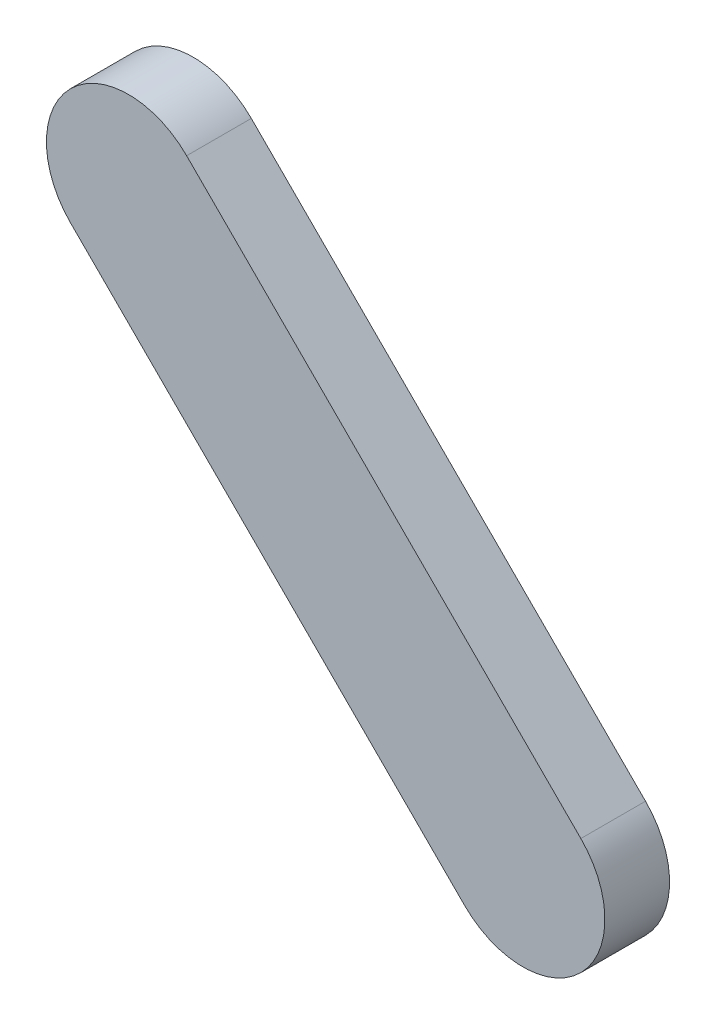
ISO-10303-21;
HEADER;
FILE_DESCRIPTION(('STEP AP214'),'2;1');
FILE_NAME('part.step','',(''),(''),'','','');
FILE_SCHEMA(('AUTOMOTIVE_DESIGN { 1 0 10303 214 1 1 1 1 }'));
ENDSEC;
DATA;
#1=APPLICATION_CONTEXT('core data for automotive mechanical design processes');
#2=APPLICATION_PROTOCOL_DEFINITION('international standard','automotive_design',2000,#1);
#3=PRODUCT_CONTEXT('',#1,'mechanical');
#4=PRODUCT('Part','Part','',(#3));
#5=PRODUCT_RELATED_PRODUCT_CATEGORY('part','',(#4));
#6=PRODUCT_DEFINITION_FORMATION('','',#4);
#7=PRODUCT_DEFINITION_CONTEXT('part definition',#1,'design');
#8=PRODUCT_DEFINITION('design','',#6,#7);
#9=PRODUCT_DEFINITION_SHAPE('','',#8);
#10=(LENGTH_UNIT() NAMED_UNIT(*) SI_UNIT(.MILLI.,.METRE.));
#11=(NAMED_UNIT(*) PLANE_ANGLE_UNIT() SI_UNIT($,.RADIAN.));
#12=(NAMED_UNIT(*) SI_UNIT($,.STERADIAN.) SOLID_ANGLE_UNIT());
#13=UNCERTAINTY_MEASURE_WITH_UNIT(LENGTH_MEASURE(1.E-05),#10,'distance_accuracy_value','');
#14=(GEOMETRIC_REPRESENTATION_CONTEXT(3) GLOBAL_UNCERTAINTY_ASSIGNED_CONTEXT((#13)) GLOBAL_UNIT_ASSIGNED_CONTEXT((#10,
#11,#12)) REPRESENTATION_CONTEXT('',''));
#15=CARTESIAN_POINT('',(0.,0.,0.));
#16=DIRECTION('',(0.,0.,1.));
#17=DIRECTION('',(1.,0.,0.));
#18=AXIS2_PLACEMENT_3D('',#15,#16,#17);
#19=CARTESIAN_POINT('',(88.0853966,54.3033966,0.));
#20=DIRECTION('',(0.707106781186548,0.707106781186548,0.));
#21=DIRECTION('',(0.707106781186548,-0.707106781186548,0.));
#22=AXIS2_PLACEMENT_3D('',#19,#20,#21);
#23=PLANE('',#22);
#24=DIRECTION('',(0.707106781186548,-0.707106781186548,0.));
#25=VECTOR('',#24,1.);
#26=CARTESIAN_POINT('',(88.0853966,54.3033966,0.1999996));
#27=LINE('',#26,#25);
#28=CARTESIAN_POINT('',(88.0853966,54.3033966,0.1999996));
#29=VERTEX_POINT('',#28);
#30=CARTESIAN_POINT('',(89.30459406,53.08419914,0.1999996));
#31=VERTEX_POINT('',#30);
#32=EDGE_CURVE('E11',#29,#31,#27,.T.);
#33=ORIENTED_EDGE('',*,*,#32,.F.);
#34=DIRECTION('',(0.,0.,1.));
#35=VECTOR('',#34,1.);
#36=CARTESIAN_POINT('',(88.0853966,54.3033966,0.));
#37=LINE('',#36,#35);
#38=CARTESIAN_POINT('',(88.0853966,54.3033966,0.));
#39=VERTEX_POINT('',#38);
#40=EDGE_CURVE('E24',#39,#29,#37,.T.);
#41=ORIENTED_EDGE('',*,*,#40,.F.);
#42=DIRECTION('',(0.707106781186548,-0.707106781186548,0.));
#43=VECTOR('',#42,1.);
#44=CARTESIAN_POINT('',(88.0853966,54.3033966,0.));
#45=LINE('',#44,#43);
#46=CARTESIAN_POINT('',(89.30459406,53.08419914,0.));
#47=VERTEX_POINT('',#46);
#48=EDGE_CURVE('E75',#39,#47,#45,.T.);
#49=ORIENTED_EDGE('',*,*,#48,.T.);
#50=DIRECTION('',(0.,0.,1.));
#51=VECTOR('',#50,1.);
#52=CARTESIAN_POINT('',(89.30459406,53.08419914,0.));
#53=LINE('',#52,#51);
#54=EDGE_CURVE('E37',#47,#31,#53,.T.);
#55=ORIENTED_EDGE('',*,*,#54,.T.);
#56=EDGE_LOOP('',(#33,#41,#49,#55));
#57=FACE_BOUND('',#56,.T.);
#58=ADVANCED_FACE('F17',(#57),#23,.F.);
#59=CARTESIAN_POINT('',(89.48419873,53.26380381,0.));
#60=DIRECTION('',(0.,0.,-1.));
#61=DIRECTION('',(-0.707106781186548,-0.707106781186548,0.));
#62=AXIS2_PLACEMENT_3D('',#59,#60,#61);
#63=CYLINDRICAL_SURFACE('',#62,0.253999360179541);
#64=CARTESIAN_POINT('',(89.48419873,53.26380381,0.1999996));
#65=DIRECTION('',(0.,0.,1.));
#66=DIRECTION('',(-0.707106781186548,-0.707106781186548,0.));
#67=AXIS2_PLACEMENT_3D('',#64,#65,#66);
#68=CIRCLE('',#67,0.253999360179541);
#69=CARTESIAN_POINT('',(89.6638034,53.44340848,0.1999996));
#70=VERTEX_POINT('',#69);
#71=EDGE_CURVE('E83',#31,#70,#68,.T.);
#72=ORIENTED_EDGE('',*,*,#71,.F.);
#73=ORIENTED_EDGE('',*,*,#54,.F.);
#74=CARTESIAN_POINT('',(89.48419873,53.26380381,0.));
#75=DIRECTION('',(0.,0.,1.));
#76=DIRECTION('',(-0.707106781186548,-0.707106781186548,0.));
#77=AXIS2_PLACEMENT_3D('',#74,#75,#76);
#78=CIRCLE('',#77,0.253999360179541);
#79=CARTESIAN_POINT('',(89.6638034,53.44340848,0.));
#80=VERTEX_POINT('',#79);
#81=EDGE_CURVE('E81',#47,#80,#78,.T.);
#82=ORIENTED_EDGE('',*,*,#81,.T.);
#83=DIRECTION('',(0.,0.,1.));
#84=VECTOR('',#83,1.);
#85=CARTESIAN_POINT('',(89.6638034,53.44340848,0.));
#86=LINE('',#85,#84);
#87=EDGE_CURVE('E67',#80,#70,#86,.T.);
#88=ORIENTED_EDGE('',*,*,#87,.T.);
#89=EDGE_LOOP('',(#72,#73,#82,#88));
#90=FACE_BOUND('',#89,.T.);
#91=ADVANCED_FACE('F89',(#90),#63,.T.);
#92=CARTESIAN_POINT('',(89.6638034,53.44340848,0.));
#93=DIRECTION('',(-0.70710678118655,-0.707106781186545,0.));
#94=DIRECTION('',(-0.707106781186545,0.70710678118655,0.));
#95=AXIS2_PLACEMENT_3D('',#92,#93,#94);
#96=PLANE('',#95);
#97=DIRECTION('',(-0.707106781186545,0.70710678118655,0.));
#98=VECTOR('',#97,1.);
#99=CARTESIAN_POINT('',(89.6638034,53.44340848,0.1999996));
#100=LINE('',#99,#98);
#101=CARTESIAN_POINT('',(88.44460594,54.66260594,0.1999996));
#102=VERTEX_POINT('',#101);
#103=EDGE_CURVE('E71',#70,#102,#100,.T.);
#104=ORIENTED_EDGE('',*,*,#103,.F.);
#105=ORIENTED_EDGE('',*,*,#87,.F.);
#106=DIRECTION('',(-0.707106781186545,0.70710678118655,0.));
#107=VECTOR('',#106,1.);
#108=CARTESIAN_POINT('',(89.6638034,53.44340848,0.));
#109=LINE('',#108,#107);
#110=CARTESIAN_POINT('',(88.44460594,54.66260594,0.));
#111=VERTEX_POINT('',#110);
#112=EDGE_CURVE('E63',#80,#111,#109,.T.);
#113=ORIENTED_EDGE('',*,*,#112,.T.);
#114=DIRECTION('',(0.,0.,1.));
#115=VECTOR('',#114,1.);
#116=CARTESIAN_POINT('',(88.44460594,54.66260594,0.));
#117=LINE('',#116,#115);
#118=EDGE_CURVE('E53',#111,#102,#117,.T.);
#119=ORIENTED_EDGE('',*,*,#118,.T.);
#120=EDGE_LOOP('',(#104,#105,#113,#119));
#121=FACE_BOUND('',#120,.T.);
#122=ADVANCED_FACE('F66',(#121),#96,.F.);
#123=CARTESIAN_POINT('',(88.26500127,54.48300127,0.));
#124=DIRECTION('',(0.,0.,-1.));
#125=DIRECTION('',(0.70710678118652,0.707106781186576,0.));
#126=AXIS2_PLACEMENT_3D('',#123,#124,#125);
#127=CYLINDRICAL_SURFACE('',#126,0.253999360179546);
#128=CARTESIAN_POINT('',(88.26500127,54.48300127,0.1999996));
#129=DIRECTION('',(0.,0.,1.));
#130=DIRECTION('',(0.70710678118652,0.707106781186576,0.));
#131=AXIS2_PLACEMENT_3D('',#128,#129,#130);
#132=CIRCLE('',#131,0.253999360179546);
#133=EDGE_CURVE('E59',#102,#29,#132,.T.);
#134=ORIENTED_EDGE('',*,*,#133,.F.);
#135=ORIENTED_EDGE('',*,*,#118,.F.);
#136=CARTESIAN_POINT('',(88.26500127,54.48300127,0.));
#137=DIRECTION('',(0.,0.,1.));
#138=DIRECTION('',(0.70710678118652,0.707106781186576,0.));
#139=AXIS2_PLACEMENT_3D('',#136,#137,#138);
#140=CIRCLE('',#139,0.253999360179546);
#141=EDGE_CURVE('E57',#111,#39,#140,.T.);
#142=ORIENTED_EDGE('',*,*,#141,.T.);
#143=ORIENTED_EDGE('',*,*,#40,.T.);
#144=EDGE_LOOP('',(#134,#135,#142,#143));
#145=FACE_BOUND('',#144,.T.);
#146=ADVANCED_FACE('F55',(#145),#127,.T.);
#147=CARTESIAN_POINT('',(88.0853966,54.3033966,0.));
#148=DIRECTION('',(0.,0.,-1.));
#149=DIRECTION('',(-1.,0.,0.));
#150=AXIS2_PLACEMENT_3D('',#147,#148,#149);
#151=PLANE('',#150);
#152=ORIENTED_EDGE('',*,*,#141,.F.);
#153=ORIENTED_EDGE('',*,*,#112,.F.);
#154=ORIENTED_EDGE('',*,*,#81,.F.);
#155=ORIENTED_EDGE('',*,*,#48,.F.);
#156=EDGE_LOOP('',(#152,#153,#154,#155));
#157=FACE_BOUND('',#156,.T.);
#158=ADVANCED_FACE('F74',(#157),#151,.T.);
#159=CARTESIAN_POINT('',(88.0853966,54.3033966,0.1999996));
#160=DIRECTION('',(0.,0.,-1.));
#161=DIRECTION('',(-1.,0.,0.));
#162=AXIS2_PLACEMENT_3D('',#159,#160,#161);
#163=PLANE('',#162);
#164=ORIENTED_EDGE('',*,*,#32,.T.);
#165=ORIENTED_EDGE('',*,*,#71,.T.);
#166=ORIENTED_EDGE('',*,*,#103,.T.);
#167=ORIENTED_EDGE('',*,*,#133,.T.);
#168=EDGE_LOOP('',(#164,#165,#166,#167));
#169=FACE_BOUND('',#168,.T.);
#170=ADVANCED_FACE('F91',(#169),#163,.F.);
#171=CLOSED_SHELL('',(#58,#91,#122,#146,#158,#170));
#172=MANIFOLD_SOLID_BREP('B1',#171);
#173=ADVANCED_BREP_SHAPE_REPRESENTATION('',(#18,#172),#14);
#174=SHAPE_DEFINITION_REPRESENTATION(#9,#173);
ENDSEC;
END-ISO-10303-21;
